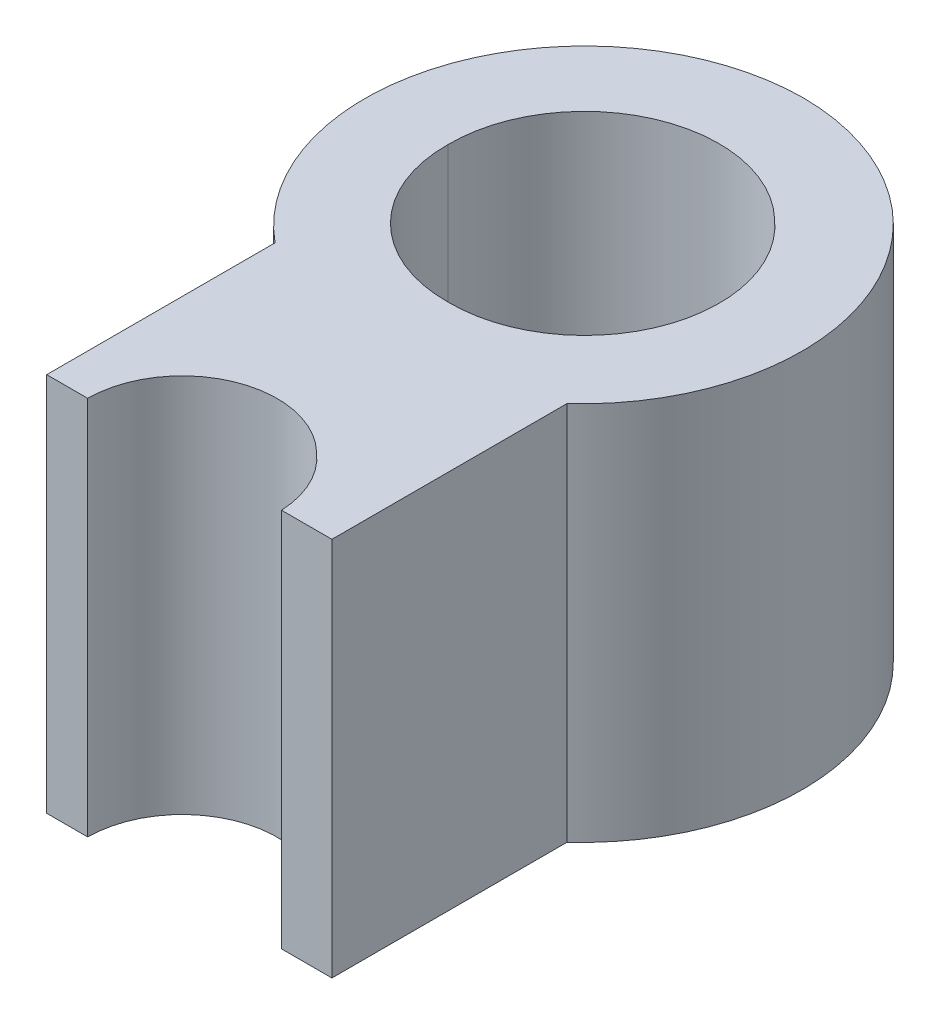
ISO-10303-21;
HEADER;
FILE_DESCRIPTION(('STEP AP214'),'2;1');
FILE_NAME('part.step','',(''),(''),'','','');
FILE_SCHEMA(('AUTOMOTIVE_DESIGN { 1 0 10303 214 1 1 1 1 }'));
ENDSEC;
DATA;
#1=APPLICATION_CONTEXT('core data for automotive mechanical design processes');
#2=APPLICATION_PROTOCOL_DEFINITION('international standard','automotive_design',2000,#1);
#3=PRODUCT_CONTEXT('',#1,'mechanical');
#4=PRODUCT('Part','Part','',(#3));
#5=PRODUCT_RELATED_PRODUCT_CATEGORY('part','',(#4));
#6=PRODUCT_DEFINITION_FORMATION('','',#4);
#7=PRODUCT_DEFINITION_CONTEXT('part definition',#1,'design');
#8=PRODUCT_DEFINITION('design','',#6,#7);
#9=PRODUCT_DEFINITION_SHAPE('','',#8);
#10=(LENGTH_UNIT() NAMED_UNIT(*) SI_UNIT(.MILLI.,.METRE.));
#11=(NAMED_UNIT(*) PLANE_ANGLE_UNIT() SI_UNIT($,.RADIAN.));
#12=(NAMED_UNIT(*) SI_UNIT($,.STERADIAN.) SOLID_ANGLE_UNIT());
#13=UNCERTAINTY_MEASURE_WITH_UNIT(LENGTH_MEASURE(1.E-05),#10,'distance_accuracy_value','');
#14=(GEOMETRIC_REPRESENTATION_CONTEXT(3) GLOBAL_UNCERTAINTY_ASSIGNED_CONTEXT((#13)) GLOBAL_UNIT_ASSIGNED_CONTEXT((#10,
#11,#12)) REPRESENTATION_CONTEXT('',''));
#15=CARTESIAN_POINT('',(0.,0.,0.));
#16=DIRECTION('',(0.,0.,1.));
#17=DIRECTION('',(1.,0.,0.));
#18=AXIS2_PLACEMENT_3D('',#15,#16,#17);
#19=CARTESIAN_POINT('',(-3.90353236004817,2.87183105039429,23.2098996244558));
#20=DIRECTION('',(0.,-1.,0.));
#21=DIRECTION('',(-0.709952197173129,0.,0.704249868817202));
#22=AXIS2_PLACEMENT_3D('',#19,#20,#21);
#23=CYLINDRICAL_SURFACE('',#22,0.425);
#24=CARTESIAN_POINT('',(-3.90353236004817,1.6718310055699,23.2098996244558));
#25=DIRECTION('',(0.,-1.,0.));
#26=DIRECTION('',(0.,0.,-1.));
#27=AXIS2_PLACEMENT_3D('',#24,#25,#26);
#28=CIRCLE('',#27,0.425);
#29=CARTESIAN_POINT('',(-3.9012240813814,1.6718310055699,23.6348933559973));
#30=VERTEX_POINT('',#29);
#31=CARTESIAN_POINT('',(-4.3284936577367,1.6718310055699,23.2041641674663));
#32=VERTEX_POINT('',#31);
#33=EDGE_CURVE('E152',#30,#32,#28,.T.);
#34=ORIENTED_EDGE('',*,*,#33,.T.);
#35=DIRECTION('',(0.,-1.,0.));
#36=VECTOR('',#35,1.);
#37=CARTESIAN_POINT('',(-4.3284936577367,2.87183105039429,23.2041641674663));
#38=LINE('',#37,#36);
#39=CARTESIAN_POINT('',(-4.3284936577367,2.87183105039429,23.2041641674663));
#40=VERTEX_POINT('',#39);
#41=EDGE_CURVE('E150',#40,#32,#38,.T.);
#42=ORIENTED_EDGE('',*,*,#41,.F.);
#43=CARTESIAN_POINT('',(-3.90353236004817,2.87183105039429,23.2098996244558));
#44=DIRECTION('',(0.,1.,0.));
#45=DIRECTION('',(0.,0.,-1.));
#46=AXIS2_PLACEMENT_3D('',#43,#44,#45);
#47=CIRCLE('',#46,0.425);
#48=CARTESIAN_POINT('',(-3.9012240813814,2.87183105039429,23.6348933559973));
#49=VERTEX_POINT('',#48);
#50=EDGE_CURVE('E136',#40,#49,#47,.T.);
#51=ORIENTED_EDGE('',*,*,#50,.T.);
#52=DIRECTION('',(0.,-1.,0.));
#53=VECTOR('',#52,1.);
#54=CARTESIAN_POINT('',(-3.9012240813814,2.87183105039429,23.6348933559973));
#55=LINE('',#54,#53);
#56=EDGE_CURVE('E11',#49,#30,#55,.T.);
#57=ORIENTED_EDGE('',*,*,#56,.T.);
#58=EDGE_LOOP('',(#34,#42,#51,#57));
#59=FACE_BOUND('',#58,.T.);
#60=ADVANCED_FACE('F17',(#59),#23,.F.);
#61=CARTESIAN_POINT('',(-3.89891580266829,2.87183105039429,23.2098996244558));
#62=DIRECTION('',(0.,-1.,0.));
#63=DIRECTION('',(0.00193323404626498,0.,0.999998131301315));
#64=AXIS2_PLACEMENT_3D('',#61,#62,#63);
#65=CYLINDRICAL_SURFACE('',#64,0.425);
#66=CARTESIAN_POINT('',(-3.89891580266829,1.6718310055699,23.2098996244558));
#67=DIRECTION('',(0.,-1.,0.));
#68=DIRECTION('',(0.,0.,-1.));
#69=AXIS2_PLACEMENT_3D('',#66,#67,#68);
#70=CIRCLE('',#69,0.425);
#71=CARTESIAN_POINT('',(-3.89496431957724,1.6718310055699,23.6348812543897));
#72=VERTEX_POINT('',#71);
#73=EDGE_CURVE('E258',#72,#30,#70,.T.);
#74=ORIENTED_EDGE('',*,*,#73,.T.);
#75=ORIENTED_EDGE('',*,*,#56,.F.);
#76=CARTESIAN_POINT('',(-3.89891580266829,2.87183105039429,23.2098996244558));
#77=DIRECTION('',(0.,1.,0.));
#78=DIRECTION('',(0.,0.,-1.));
#79=AXIS2_PLACEMENT_3D('',#76,#77,#78);
#80=CIRCLE('',#79,0.425);
#81=CARTESIAN_POINT('',(-3.89496431957724,2.87183105039429,23.6348812543897));
#82=VERTEX_POINT('',#81);
#83=EDGE_CURVE('E144',#49,#82,#80,.T.);
#84=ORIENTED_EDGE('',*,*,#83,.T.);
#85=DIRECTION('',(0.,-1.,0.));
#86=VECTOR('',#85,1.);
#87=CARTESIAN_POINT('',(-3.89496431957724,2.87183105039429,23.6348812543897));
#88=LINE('',#87,#86);
#89=EDGE_CURVE('E157',#82,#72,#88,.T.);
#90=ORIENTED_EDGE('',*,*,#89,.T.);
#91=EDGE_LOOP('',(#74,#75,#84,#90));
#92=FACE_BOUND('',#91,.T.);
#93=ADVANCED_FACE('F19',(#92),#65,.F.);
#94=CARTESIAN_POINT('',(-3.90353236004812,2.87183105039429,24.4684287104753));
#95=DIRECTION('',(0.,-1.,0.));
#96=DIRECTION('',(-0.38788843061661,0.,-0.92170633359752));
#97=AXIS2_PLACEMENT_3D('',#94,#95,#96);
#98=CYLINDRICAL_SURFACE('',#97,0.299999999999991);
#99=CARTESIAN_POINT('',(-3.90353236004812,1.6718310055699,24.4684287104753));
#100=DIRECTION('',(0.,-1.,0.));
#101=DIRECTION('',(0.999103542626609,0.,0.0423333333315546));
#102=AXIS2_PLACEMENT_3D('',#99,#100,#101);
#103=CIRCLE('',#102,0.299999999999991);
#104=CARTESIAN_POINT('',(-4.20352984228346,1.6718310055699,24.4671996244558));
#105=VERTEX_POINT('',#104);
#106=CARTESIAN_POINT('',(-3.69468742470163,1.6718310055699,24.253059741076));
#107=VERTEX_POINT('',#106);
#108=EDGE_CURVE('E229',#105,#107,#103,.T.);
#109=ORIENTED_EDGE('',*,*,#108,.T.);
#110=DIRECTION('',(0.,-1.,0.));
#111=VECTOR('',#110,1.);
#112=CARTESIAN_POINT('',(-3.69468742470163,2.87183105039429,24.253059741076));
#113=LINE('',#112,#111);
#114=CARTESIAN_POINT('',(-3.69468742470163,2.87183105039429,24.253059741076));
#115=VERTEX_POINT('',#114);
#116=EDGE_CURVE('E219',#115,#107,#113,.T.);
#117=ORIENTED_EDGE('',*,*,#116,.F.);
#118=CARTESIAN_POINT('',(-3.90353236004812,2.87183105039429,24.4684287104753));
#119=DIRECTION('',(0.,1.,0.));
#120=DIRECTION('',(0.999103542626609,0.,0.0423333333315546));
#121=AXIS2_PLACEMENT_3D('',#118,#119,#120);
#122=CIRCLE('',#121,0.299999999999991);
#123=CARTESIAN_POINT('',(-4.20352984228347,2.87183105039429,24.4671996244558));
#124=VERTEX_POINT('',#123);
#125=EDGE_CURVE('E208',#115,#124,#122,.T.);
#126=ORIENTED_EDGE('',*,*,#125,.T.);
#127=DIRECTION('',(0.,-1.,0.));
#128=VECTOR('',#127,1.);
#129=CARTESIAN_POINT('',(-4.20352984228347,2.87183105039429,24.4671996244558));
#130=LINE('',#129,#128);
#131=EDGE_CURVE('E26',#124,#105,#130,.T.);
#132=ORIENTED_EDGE('',*,*,#131,.T.);
#133=EDGE_LOOP('',(#109,#117,#126,#132));
#134=FACE_BOUND('',#133,.T.);
#135=ADVANCED_FACE('F227',(#134),#98,.F.);
#136=CARTESIAN_POINT('',(-4.20352984228347,2.87183105039429,24.4671996244558));
#137=DIRECTION('',(1.62432664225037E-12,0.,1.));
#138=DIRECTION('',(1.,0.,-1.62432664225037E-12));
#139=AXIS2_PLACEMENT_3D('',#136,#137,#138);
#140=PLANE('',#139);
#141=DIRECTION('',(1.,0.,-1.62432664225037E-12));
#142=VECTOR('',#141,1.);
#143=CARTESIAN_POINT('',(-1.46908110115859,1.6718310055699,24.4671996244514));
#144=LINE('',#143,#142);
#145=CARTESIAN_POINT('',(-4.33289192535477,1.6718310055699,24.467199624456));
#146=VERTEX_POINT('',#145);
#147=EDGE_CURVE('E235',#146,#105,#144,.T.);
#148=ORIENTED_EDGE('',*,*,#147,.T.);
#149=ORIENTED_EDGE('',*,*,#131,.F.);
#150=DIRECTION('',(1.,0.,-1.62432664225037E-12));
#151=VECTOR('',#150,1.);
#152=CARTESIAN_POINT('',(-4.33289192535478,2.87183105039429,24.467199624456));
#153=LINE('',#152,#151);
#154=CARTESIAN_POINT('',(-4.33289192535478,2.87183105039429,24.467199624456));
#155=VERTEX_POINT('',#154);
#156=EDGE_CURVE('E207',#155,#124,#153,.T.);
#157=ORIENTED_EDGE('',*,*,#156,.F.);
#158=DIRECTION('',(0.,-1.,0.));
#159=VECTOR('',#158,1.);
#160=CARTESIAN_POINT('',(-4.33289192535478,2.87183105039429,24.467199624456));
#161=LINE('',#160,#159);
#162=EDGE_CURVE('E202',#155,#146,#161,.T.);
#163=ORIENTED_EDGE('',*,*,#162,.T.);
#164=EDGE_LOOP('',(#148,#149,#157,#163));
#165=FACE_BOUND('',#164,.T.);
#166=ADVANCED_FACE('F236',(#165),#140,.T.);
#167=CARTESIAN_POINT('',(-3.43210099878565,2.87183105039429,24.4671996244556));
#168=DIRECTION('',(-1.06337566312106E-12,0.,1.));
#169=DIRECTION('',(1.,0.,1.06337566312106E-12));
#170=AXIS2_PLACEMENT_3D('',#167,#168,#169);
#171=PLANE('',#170);
#172=DIRECTION('',(1.,0.,1.06337566312106E-12));
#173=VECTOR('',#172,1.);
#174=CARTESIAN_POINT('',(-1.08336667942161,1.6718310055699,24.4671996244581));
#175=LINE('',#174,#173);
#176=CARTESIAN_POINT('',(-3.59128177368775,1.6718310055699,24.4671996244555));
#177=VERTEX_POINT('',#176);
#178=CARTESIAN_POINT('',(-3.43210099878565,1.6718310055699,24.4671996244556));
#179=VERTEX_POINT('',#178);
#180=EDGE_CURVE('E251',#177,#179,#175,.T.);
#181=ORIENTED_EDGE('',*,*,#180,.T.);
#182=DIRECTION('',(0.,-1.,0.));
#183=VECTOR('',#182,1.);
#184=CARTESIAN_POINT('',(-3.43210099878565,2.87183105039429,24.4671996244556));
#185=LINE('',#184,#183);
#186=CARTESIAN_POINT('',(-3.43210099878565,2.87183105039429,24.4671996244556));
#187=VERTEX_POINT('',#186);
#188=EDGE_CURVE('E182',#187,#179,#185,.T.);
#189=ORIENTED_EDGE('',*,*,#188,.F.);
#190=DIRECTION('',(-1.,0.,-1.06337566312106E-12));
#191=VECTOR('',#190,1.);
#192=CARTESIAN_POINT('',(-3.43210099878565,2.87183105039429,24.4671996244556));
#193=LINE('',#192,#191);
#194=CARTESIAN_POINT('',(-3.59128177368776,2.87183105039429,24.4671996244555));
#195=VERTEX_POINT('',#194);
#196=EDGE_CURVE('E147',#187,#195,#193,.T.);
#197=ORIENTED_EDGE('',*,*,#196,.T.);
#198=DIRECTION('',(0.,-1.,0.));
#199=VECTOR('',#198,1.);
#200=CARTESIAN_POINT('',(-3.59128177368776,2.87183105039429,24.4671996244555));
#201=LINE('',#200,#199);
#202=EDGE_CURVE('E46',#195,#177,#201,.T.);
#203=ORIENTED_EDGE('',*,*,#202,.T.);
#204=EDGE_LOOP('',(#181,#189,#197,#203));
#205=FACE_BOUND('',#204,.T.);
#206=ADVANCED_FACE('F289',(#205),#171,.T.);
#207=CARTESIAN_POINT('',(-3.8910128364757,2.87183105039429,24.4798996244558));
#208=DIRECTION('',(0.,-1.,0.));
#209=DIRECTION('',(0.999103542626486,0.,-0.0423333333344553));
#210=AXIS2_PLACEMENT_3D('',#207,#208,#209);
#211=CYLINDRICAL_SURFACE('',#210,0.299999999999992);
#212=CARTESIAN_POINT('',(-3.8910128364757,1.6718310055699,24.4798996244558));
#213=DIRECTION('',(0.,-1.,0.));
#214=DIRECTION('',(0.999103542626486,0.,-0.0423333333344553));
#215=AXIS2_PLACEMENT_3D('',#212,#213,#214);
#216=CIRCLE('',#215,0.299999999999992);
#217=EDGE_CURVE('E245',#107,#177,#216,.T.);
#218=ORIENTED_EDGE('',*,*,#217,.T.);
#219=ORIENTED_EDGE('',*,*,#202,.F.);
#220=CARTESIAN_POINT('',(-3.8910128364757,2.87183105039429,24.4798996244558));
#221=DIRECTION('',(0.,1.,0.));
#222=DIRECTION('',(0.999103542626486,0.,-0.0423333333344553));
#223=AXIS2_PLACEMENT_3D('',#220,#221,#222);
#224=CIRCLE('',#223,0.299999999999992);
#225=EDGE_CURVE('E212',#195,#115,#224,.T.);
#226=ORIENTED_EDGE('',*,*,#225,.T.);
#227=ORIENTED_EDGE('',*,*,#116,.T.);
#228=EDGE_LOOP('',(#218,#219,#226,#227));
#229=FACE_BOUND('',#228,.T.);
#230=ADVANCED_FACE('F296',(#229),#211,.F.);
#231=CARTESIAN_POINT('',(1.26536763995187,2.87183105039429,15.59112871048));
#232=DIRECTION('',(0.,1.,0.));
#233=DIRECTION('',(0.,0.,-1.));
#234=AXIS2_PLACEMENT_3D('',#231,#232,#233);
#235=PLANE('',#234);
#236=ORIENTED_EDGE('',*,*,#50,.F.);
#237=CARTESIAN_POINT('',(-3.90353236004814,2.87183105039429,23.1984287104753));
#238=DIRECTION('',(0.,1.,0.));
#239=DIRECTION('',(0.,0.,1.));
#240=AXIS2_PLACEMENT_3D('',#237,#238,#239);
#241=CIRCLE('',#240,0.425);
#242=CARTESIAN_POINT('',(-3.61021923348984,2.87183105039429,22.8908699196911));
#243=VERTEX_POINT('',#242);
#244=EDGE_CURVE('E142',#243,#40,#241,.T.);
#245=ORIENTED_EDGE('',*,*,#244,.F.);
#246=CARTESIAN_POINT('',(-3.89101283647572,2.87183105039429,23.2098996244558));
#247=DIRECTION('',(0.,1.,0.));
#248=DIRECTION('',(0.,0.,-1.));
#249=AXIS2_PLACEMENT_3D('',#246,#247,#248);
#250=CIRCLE('',#249,0.425);
#251=EDGE_CURVE('E172',#82,#243,#250,.T.);
#252=ORIENTED_EDGE('',*,*,#251,.F.);
#253=ORIENTED_EDGE('',*,*,#83,.F.);
#254=EDGE_LOOP('',(#236,#245,#252,#253));
#255=FACE_BOUND('',#254,.T.);
#256=DIRECTION('',(0.,0.,1.));
#257=VECTOR('',#256,1.);
#258=CARTESIAN_POINT('',(-4.33289908652409,2.87183105039429,19.7789372226181));
#259=LINE('',#258,#257);
#260=CARTESIAN_POINT('',(-4.33289908652409,2.87183105039429,23.7461036745279));
#261=VERTEX_POINT('',#260);
#262=EDGE_CURVE('E203',#261,#155,#259,.T.);
#263=ORIENTED_EDGE('',*,*,#262,.T.);
#264=ORIENTED_EDGE('',*,*,#156,.T.);
#265=ORIENTED_EDGE('',*,*,#125,.F.);
#266=ORIENTED_EDGE('',*,*,#225,.F.);
#267=ORIENTED_EDGE('',*,*,#196,.F.);
#268=DIRECTION('',(5.02522919053297E-13,0.,-1.));
#269=VECTOR('',#268,1.);
#270=CARTESIAN_POINT('',(-3.43210099878565,2.87183105039429,24.4671996244556));
#271=LINE('',#270,#269);
#272=CARTESIAN_POINT('',(-3.43210099878548,2.87183105039429,23.7245472516449));
#273=VERTEX_POINT('',#272);
#274=EDGE_CURVE('E178',#187,#273,#271,.T.);
#275=ORIENTED_EDGE('',*,*,#274,.T.);
#276=CARTESIAN_POINT('',(-3.89891580266829,2.87183105039429,23.2098996244558));
#277=DIRECTION('',(0.,1.,0.));
#278=DIRECTION('',(0.,0.,-1.));
#279=AXIS2_PLACEMENT_3D('',#276,#277,#278);
#280=CIRCLE('',#279,0.694822453073876);
#281=CARTESIAN_POINT('',(-3.89496431956289,2.87183105039429,22.5150884075939));
#282=VERTEX_POINT('',#281);
#283=EDGE_CURVE('E188',#273,#282,#280,.T.);
#284=ORIENTED_EDGE('',*,*,#283,.T.);
#285=CARTESIAN_POINT('',(-3.89101283647572,2.87183105039429,23.2098996244558));
#286=DIRECTION('',(0.,1.,0.));
#287=DIRECTION('',(0.,0.,-1.));
#288=AXIS2_PLACEMENT_3D('',#285,#286,#287);
#289=CIRCLE('',#288,0.694822453073876);
#290=EDGE_CURVE('E196',#282,#261,#289,.T.);
#291=ORIENTED_EDGE('',*,*,#290,.T.);
#292=EDGE_LOOP('',(#263,#264,#265,#266,#267,#275,#284,#291));
#293=FACE_BOUND('',#292,.T.);
#294=ADVANCED_FACE('F138',(#255,#293),#235,.T.);
#295=CARTESIAN_POINT('',(-4.33289908652409,2.87183105039429,23.9667457347561));
#296=DIRECTION('',(-1.,0.,0.));
#297=DIRECTION('',(0.,0.,1.));
#298=AXIS2_PLACEMENT_3D('',#295,#296,#297);
#299=PLANE('',#298);
#300=DIRECTION('',(0.,0.,1.));
#301=VECTOR('',#300,1.);
#302=CARTESIAN_POINT('',(-4.33289908652409,1.6718310055699,19.7789372226181));
#303=LINE('',#302,#301);
#304=CARTESIAN_POINT('',(-4.33289908652408,1.6718310055699,23.7461036745279));
#305=VERTEX_POINT('',#304);
#306=EDGE_CURVE('E344',#305,#146,#303,.T.);
#307=ORIENTED_EDGE('',*,*,#306,.T.);
#308=ORIENTED_EDGE('',*,*,#162,.F.);
#309=ORIENTED_EDGE('',*,*,#262,.F.);
#310=DIRECTION('',(0.,1.,0.));
#311=VECTOR('',#310,1.);
#312=CARTESIAN_POINT('',(-4.33289908652409,2.87183105039429,23.7461036745279));
#313=LINE('',#312,#311);
#314=EDGE_CURVE('E192',#305,#261,#313,.T.);
#315=ORIENTED_EDGE('',*,*,#314,.F.);
#316=EDGE_LOOP('',(#307,#308,#309,#315));
#317=FACE_BOUND('',#316,.T.);
#318=ADVANCED_FACE('F301',(#317),#299,.T.);
#319=CARTESIAN_POINT('',(-3.89101283647572,2.87183105039429,23.2098996244558));
#320=DIRECTION('',(0.,-1.,0.));
#321=DIRECTION('',(0.,0.,-1.));
#322=AXIS2_PLACEMENT_3D('',#319,#320,#321);
#323=CYLINDRICAL_SURFACE('',#322,0.694822453073876);
#324=CARTESIAN_POINT('',(-3.89101283647572,1.6718310055699,23.2098996244558));
#325=DIRECTION('',(0.,1.,0.));
#326=DIRECTION('',(0.,0.,-1.));
#327=AXIS2_PLACEMENT_3D('',#324,#325,#326);
#328=CIRCLE('',#327,0.694822453073876);
#329=CARTESIAN_POINT('',(-3.89496431956288,1.6718310055699,22.5150884075939));
#330=VERTEX_POINT('',#329);
#331=EDGE_CURVE('E341',#330,#305,#328,.T.);
#332=ORIENTED_EDGE('',*,*,#331,.T.);
#333=ORIENTED_EDGE('',*,*,#314,.T.);
#334=ORIENTED_EDGE('',*,*,#290,.F.);
#335=DIRECTION('',(0.,-1.,0.));
#336=VECTOR('',#335,1.);
#337=CARTESIAN_POINT('',(-3.89496431956289,2.87183105039429,22.5150884075939));
#338=LINE('',#337,#336);
#339=EDGE_CURVE('E185',#282,#330,#338,.T.);
#340=ORIENTED_EDGE('',*,*,#339,.T.);
#341=EDGE_LOOP('',(#332,#333,#334,#340));
#342=FACE_BOUND('',#341,.T.);
#343=ADVANCED_FACE('F303',(#342),#323,.T.);
#344=CARTESIAN_POINT('',(-3.89891580266829,2.87183105039429,23.2098996244558));
#345=DIRECTION('',(0.,-1.,0.));
#346=DIRECTION('',(0.,0.,-1.));
#347=AXIS2_PLACEMENT_3D('',#344,#345,#346);
#348=CYLINDRICAL_SURFACE('',#347,0.694822453073876);
#349=CARTESIAN_POINT('',(-3.89891580266829,1.6718310055699,23.2098996244558));
#350=DIRECTION('',(0.,1.,0.));
#351=DIRECTION('',(0.,0.,-1.));
#352=AXIS2_PLACEMENT_3D('',#349,#350,#351);
#353=CIRCLE('',#352,0.694822453073876);
#354=CARTESIAN_POINT('',(-3.43210099878547,1.6718310055699,23.7245472516449));
#355=VERTEX_POINT('',#354);
#356=EDGE_CURVE('E333',#355,#330,#353,.T.);
#357=ORIENTED_EDGE('',*,*,#356,.T.);
#358=ORIENTED_EDGE('',*,*,#339,.F.);
#359=ORIENTED_EDGE('',*,*,#283,.F.);
#360=DIRECTION('',(0.,-1.,0.));
#361=VECTOR('',#360,1.);
#362=CARTESIAN_POINT('',(-3.43210099878548,2.87183105039429,23.7245472516449));
#363=LINE('',#362,#361);
#364=EDGE_CURVE('E175',#273,#355,#363,.T.);
#365=ORIENTED_EDGE('',*,*,#364,.T.);
#366=EDGE_LOOP('',(#357,#358,#359,#365));
#367=FACE_BOUND('',#366,.T.);
#368=ADVANCED_FACE('F309',(#367),#348,.T.);
#369=CARTESIAN_POINT('',(-3.43210099878528,2.87183105039429,23.7316065982669));
#370=DIRECTION('',(1.,0.,5.02522919053297E-13));
#371=DIRECTION('',(-5.02522919053297E-13,0.,1.));
#372=AXIS2_PLACEMENT_3D('',#369,#370,#371);
#373=PLANE('',#372);
#374=DIRECTION('',(5.02522919053297E-13,0.,-1.));
#375=VECTOR('',#374,1.);
#376=CARTESIAN_POINT('',(-3.43210099878323,1.6718310055699,19.6613676543723));
#377=LINE('',#376,#375);
#378=EDGE_CURVE('E327',#179,#355,#377,.T.);
#379=ORIENTED_EDGE('',*,*,#378,.T.);
#380=ORIENTED_EDGE('',*,*,#364,.F.);
#381=ORIENTED_EDGE('',*,*,#274,.F.);
#382=ORIENTED_EDGE('',*,*,#188,.T.);
#383=EDGE_LOOP('',(#379,#380,#381,#382));
#384=FACE_BOUND('',#383,.T.);
#385=ADVANCED_FACE('F308',(#384),#373,.T.);
#386=CARTESIAN_POINT('',(-3.89101283647572,2.87183105039429,23.2098996244558));
#387=DIRECTION('',(0.,-1.,0.));
#388=DIRECTION('',(0.933938659324012,0.,0.357433323320682));
#389=AXIS2_PLACEMENT_3D('',#386,#387,#388);
#390=CYLINDRICAL_SURFACE('',#389,0.425);
#391=CARTESIAN_POINT('',(-3.89101283647572,1.6718310055699,23.2098996244558));
#392=DIRECTION('',(0.,-1.,0.));
#393=DIRECTION('',(0.,0.,-1.));
#394=AXIS2_PLACEMENT_3D('',#391,#392,#393);
#395=CIRCLE('',#394,0.425);
#396=CARTESIAN_POINT('',(-3.61021923348983,1.6718310055699,22.8908699196911));
#397=VERTEX_POINT('',#396);
#398=EDGE_CURVE('E254',#397,#72,#395,.T.);
#399=ORIENTED_EDGE('',*,*,#398,.T.);
#400=ORIENTED_EDGE('',*,*,#89,.F.);
#401=ORIENTED_EDGE('',*,*,#251,.T.);
#402=DIRECTION('',(0.,-1.,0.));
#403=VECTOR('',#402,1.);
#404=CARTESIAN_POINT('',(-3.61021923348984,2.87183105039429,22.8908699196911));
#405=LINE('',#404,#403);
#406=EDGE_CURVE('E160',#243,#397,#405,.T.);
#407=ORIENTED_EDGE('',*,*,#406,.T.);
#408=EDGE_LOOP('',(#399,#400,#401,#407));
#409=FACE_BOUND('',#408,.T.);
#410=ADVANCED_FACE('F280',(#409),#390,.F.);
#411=CARTESIAN_POINT('',(-3.90353236004814,2.87183105039429,23.1984287104753));
#412=DIRECTION('',(0.,-1.,0.));
#413=DIRECTION('',(-0.399800169203855,0.,-0.916602326368731));
#414=AXIS2_PLACEMENT_3D('',#411,#412,#413);
#415=CYLINDRICAL_SURFACE('',#414,0.425);
#416=CARTESIAN_POINT('',(-3.90353236004814,1.6718310055699,23.1984287104753));
#417=DIRECTION('',(0.,-1.,0.));
#418=DIRECTION('',(0.,0.,1.));
#419=AXIS2_PLACEMENT_3D('',#416,#417,#418);
#420=CIRCLE('',#419,0.425);
#421=EDGE_CURVE('E167',#32,#397,#420,.T.);
#422=ORIENTED_EDGE('',*,*,#421,.T.);
#423=ORIENTED_EDGE('',*,*,#406,.F.);
#424=ORIENTED_EDGE('',*,*,#244,.T.);
#425=ORIENTED_EDGE('',*,*,#41,.T.);
#426=EDGE_LOOP('',(#422,#423,#424,#425));
#427=FACE_BOUND('',#426,.T.);
#428=ADVANCED_FACE('F159',(#427),#415,.F.);
#429=CARTESIAN_POINT('',(1.26536763995188,1.6718310055699,15.59112871048));
#430=DIRECTION('',(0.,1.,0.));
#431=DIRECTION('',(0.,0.,-1.));
#432=AXIS2_PLACEMENT_3D('',#429,#430,#431);
#433=PLANE('',#432);
#434=ORIENTED_EDGE('',*,*,#33,.F.);
#435=ORIENTED_EDGE('',*,*,#73,.F.);
#436=ORIENTED_EDGE('',*,*,#398,.F.);
#437=ORIENTED_EDGE('',*,*,#421,.F.);
#438=EDGE_LOOP('',(#434,#435,#436,#437));
#439=FACE_BOUND('',#438,.T.);
#440=ORIENTED_EDGE('',*,*,#306,.F.);
#441=ORIENTED_EDGE('',*,*,#331,.F.);
#442=ORIENTED_EDGE('',*,*,#356,.F.);
#443=ORIENTED_EDGE('',*,*,#378,.F.);
#444=ORIENTED_EDGE('',*,*,#180,.F.);
#445=ORIENTED_EDGE('',*,*,#217,.F.);
#446=ORIENTED_EDGE('',*,*,#108,.F.);
#447=ORIENTED_EDGE('',*,*,#147,.F.);
#448=EDGE_LOOP('',(#440,#441,#442,#443,#444,#445,#446,#447));
#449=FACE_BOUND('',#448,.T.);
#450=ADVANCED_FACE('F243',(#439,#449),#433,.F.);
#451=CLOSED_SHELL('',(#60,#93,#135,#166,#206,#230,#294,#318,#343,#368,#385,#410,#428,#450));
#452=MANIFOLD_SOLID_BREP('B1',#451);
#453=ADVANCED_BREP_SHAPE_REPRESENTATION('',(#18,#452),#14);
#454=SHAPE_DEFINITION_REPRESENTATION(#9,#453);
ENDSEC;
END-ISO-10303-21;
